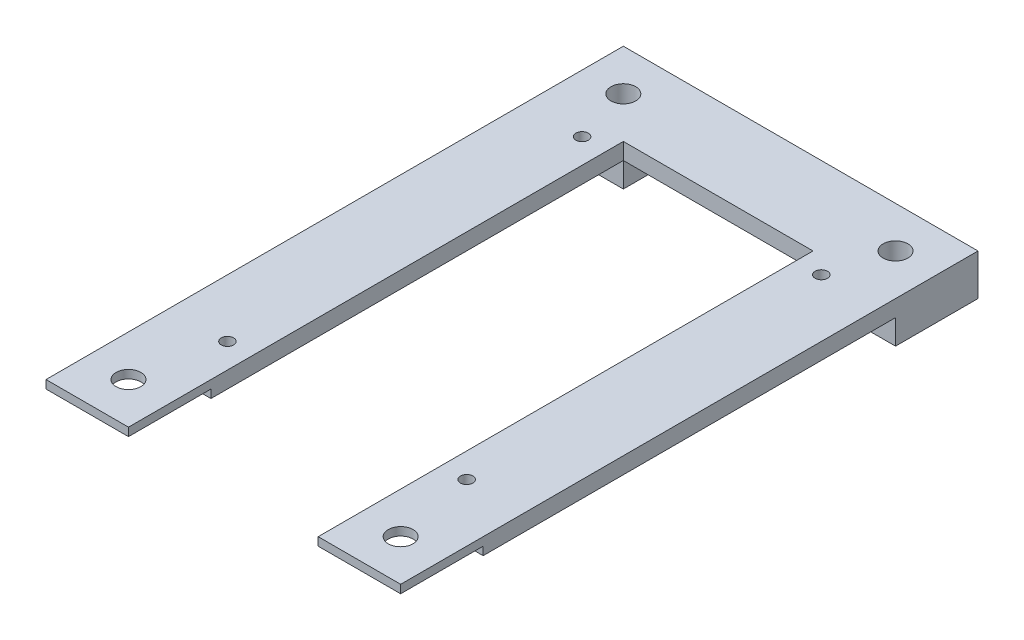
ISO-10303-21;
HEADER;
FILE_DESCRIPTION(('STEP AP214'),'2;1');
FILE_NAME('part.step','',(''),(''),'','','');
FILE_SCHEMA(('AUTOMOTIVE_DESIGN { 1 0 10303 214 1 1 1 1 }'));
ENDSEC;
DATA;
#1=APPLICATION_CONTEXT('core data for automotive mechanical design processes');
#2=APPLICATION_PROTOCOL_DEFINITION('international standard','automotive_design',2000,#1);
#3=PRODUCT_CONTEXT('',#1,'mechanical');
#4=PRODUCT('Part','Part','',(#3));
#5=PRODUCT_RELATED_PRODUCT_CATEGORY('part','',(#4));
#6=PRODUCT_DEFINITION_FORMATION('','',#4);
#7=PRODUCT_DEFINITION_CONTEXT('part definition',#1,'design');
#8=PRODUCT_DEFINITION('design','',#6,#7);
#9=PRODUCT_DEFINITION_SHAPE('','',#8);
#10=(LENGTH_UNIT() NAMED_UNIT(*) SI_UNIT(.MILLI.,.METRE.));
#11=(NAMED_UNIT(*) PLANE_ANGLE_UNIT() SI_UNIT($,.RADIAN.));
#12=(NAMED_UNIT(*) SI_UNIT($,.STERADIAN.) SOLID_ANGLE_UNIT());
#13=UNCERTAINTY_MEASURE_WITH_UNIT(LENGTH_MEASURE(1.E-05),#10,'distance_accuracy_value','');
#14=(GEOMETRIC_REPRESENTATION_CONTEXT(3) GLOBAL_UNCERTAINTY_ASSIGNED_CONTEXT((#13)) GLOBAL_UNIT_ASSIGNED_CONTEXT((#10,
#11,#12)) REPRESENTATION_CONTEXT('',''));
#15=CARTESIAN_POINT('',(0.,0.,0.));
#16=DIRECTION('',(0.,0.,1.));
#17=DIRECTION('',(1.,0.,0.));
#18=AXIS2_PLACEMENT_3D('',#15,#16,#17);
#19=CARTESIAN_POINT('',(66.,4.,-120.));
#20=DIRECTION('',(0.,0.,-1.));
#21=DIRECTION('',(-1.,0.,0.));
#22=AXIS2_PLACEMENT_3D('',#19,#20,#21);
#23=PLANE('',#22);
#24=DIRECTION('',(-1.,0.,0.));
#25=VECTOR('',#24,1.);
#26=CARTESIAN_POINT('',(66.,-6.,-120.));
#27=LINE('',#26,#25);
#28=CARTESIAN_POINT('',(20.,-6.,-120.));
#29=VERTEX_POINT('',#28);
#30=CARTESIAN_POINT('',(0.,-6.,-120.));
#31=VERTEX_POINT('',#30);
#32=EDGE_CURVE('E189',#29,#31,#27,.T.);
#33=ORIENTED_EDGE('',*,*,#32,.F.);
#34=DIRECTION('',(0.,-1.,0.));
#35=VECTOR('',#34,1.);
#36=CARTESIAN_POINT('',(20.,0.,-120.));
#37=LINE('',#36,#35);
#38=CARTESIAN_POINT('',(20.,0.,-120.));
#39=VERTEX_POINT('',#38);
#40=EDGE_CURVE('E166',#39,#29,#37,.T.);
#41=ORIENTED_EDGE('',*,*,#40,.F.);
#42=DIRECTION('',(-1.,0.,0.));
#43=VECTOR('',#42,1.);
#44=CARTESIAN_POINT('',(20.,0.,-120.));
#45=LINE('',#44,#43);
#46=CARTESIAN_POINT('',(0.,0.,-120.));
#47=VERTEX_POINT('',#46);
#48=EDGE_CURVE('E11',#39,#47,#45,.T.);
#49=ORIENTED_EDGE('',*,*,#48,.T.);
#50=DIRECTION('',(0.,1.,0.));
#51=VECTOR('',#50,1.);
#52=CARTESIAN_POINT('',(0.,-6.,-120.));
#53=LINE('',#52,#51);
#54=EDGE_CURVE('E196',#31,#47,#53,.T.);
#55=ORIENTED_EDGE('',*,*,#54,.F.);
#56=EDGE_LOOP('',(#33,#41,#49,#55));
#57=FACE_BOUND('',#56,.T.);
#58=ADVANCED_FACE('F38',(#57),#23,.F.);
#59=DIRECTION('',(0.,-1.,0.));
#60=VECTOR('',#59,1.);
#61=CARTESIAN_POINT('',(20.,4.,-120.));
#62=LINE('',#61,#60);
#63=CARTESIAN_POINT('',(20.,4.,-120.));
#64=VERTEX_POINT('',#63);
#65=EDGE_CURVE('E262',#64,#39,#62,.T.);
#66=ORIENTED_EDGE('',*,*,#65,.T.);
#67=DIRECTION('',(-1.,0.,0.));
#68=VECTOR('',#67,1.);
#69=CARTESIAN_POINT('',(20.,0.,-120.));
#70=LINE('',#69,#68);
#71=CARTESIAN_POINT('',(66.,0.,-120.));
#72=VERTEX_POINT('',#71);
#73=EDGE_CURVE('E180',#72,#39,#70,.T.);
#74=ORIENTED_EDGE('',*,*,#73,.F.);
#75=DIRECTION('',(0.,-1.,0.));
#76=VECTOR('',#75,1.);
#77=CARTESIAN_POINT('',(66.,4.,-120.));
#78=LINE('',#77,#76);
#79=CARTESIAN_POINT('',(66.,4.,-120.));
#80=VERTEX_POINT('',#79);
#81=EDGE_CURVE('E259',#80,#72,#78,.T.);
#82=ORIENTED_EDGE('',*,*,#81,.F.);
#83=DIRECTION('',(1.,0.,0.));
#84=VECTOR('',#83,1.);
#85=CARTESIAN_POINT('',(66.,4.,-120.));
#86=LINE('',#85,#84);
#87=EDGE_CURVE('E224',#64,#80,#86,.T.);
#88=ORIENTED_EDGE('',*,*,#87,.F.);
#89=EDGE_LOOP('',(#66,#74,#82,#88));
#90=FACE_BOUND('',#89,.T.);
#91=ADVANCED_FACE('F309',(#90),#23,.F.);
#92=CARTESIAN_POINT('',(0.,-6.,0.));
#93=DIRECTION('',(0.,-1.,0.));
#94=DIRECTION('',(0.,0.,-1.));
#95=AXIS2_PLACEMENT_3D('',#92,#93,#94);
#96=PLANE('',#95);
#97=DIRECTION('',(0.,0.,1.));
#98=VECTOR('',#97,1.);
#99=CARTESIAN_POINT('',(20.,-6.,-140.));
#100=LINE('',#99,#98);
#101=CARTESIAN_POINT('',(20.,-6.,-140.));
#102=VERTEX_POINT('',#101);
#103=EDGE_CURVE('E160',#102,#29,#100,.T.);
#104=ORIENTED_EDGE('',*,*,#103,.T.);
#105=ORIENTED_EDGE('',*,*,#32,.T.);
#106=DIRECTION('',(0.,0.,-1.));
#107=VECTOR('',#106,1.);
#108=CARTESIAN_POINT('',(0.,-6.,-120.));
#109=LINE('',#108,#107);
#110=CARTESIAN_POINT('',(0.,-6.,-140.));
#111=VERTEX_POINT('',#110);
#112=EDGE_CURVE('E185',#31,#111,#109,.T.);
#113=ORIENTED_EDGE('',*,*,#112,.T.);
#114=DIRECTION('',(1.,0.,0.));
#115=VECTOR('',#114,1.);
#116=CARTESIAN_POINT('',(0.,-6.,-140.));
#117=LINE('',#116,#115);
#118=EDGE_CURVE('E177',#111,#102,#117,.T.);
#119=ORIENTED_EDGE('',*,*,#118,.T.);
#120=EDGE_LOOP('',(#104,#105,#113,#119));
#121=FACE_BOUND('',#120,.T.);
#122=CARTESIAN_POINT('',(10.,-6.,-130.));
#123=DIRECTION('',(0.,-1.,0.));
#124=DIRECTION('',(0.,0.,-1.));
#125=AXIS2_PLACEMENT_3D('',#122,#123,#124);
#126=CIRCLE('',#125,3.);
#127=CARTESIAN_POINT('',(10.,-6.,-133.));
#128=VERTEX_POINT('',#127);
#129=EDGE_CURVE('E199',#128,#128,#126,.T.);
#130=ORIENTED_EDGE('',*,*,#129,.F.);
#131=EDGE_LOOP('',(#130));
#132=FACE_BOUND('',#131,.T.);
#133=ADVANCED_FACE('F182',(#121,#132),#96,.T.);
#134=CARTESIAN_POINT('',(0.,0.,0.));
#135=DIRECTION('',(0.,-1.,0.));
#136=DIRECTION('',(0.,0.,-1.));
#137=AXIS2_PLACEMENT_3D('',#134,#135,#136);
#138=PLANE('',#137);
#139=CARTESIAN_POINT('',(14.,0.,-116.));
#140=DIRECTION('',(0.,-1.,0.));
#141=DIRECTION('',(0.,0.,-1.));
#142=AXIS2_PLACEMENT_3D('',#139,#140,#141);
#143=CIRCLE('',#142,1.5);
#144=CARTESIAN_POINT('',(14.,0.,-117.5));
#145=VERTEX_POINT('',#144);
#146=EDGE_CURVE('E386',#145,#145,#143,.T.);
#147=ORIENTED_EDGE('',*,*,#146,.F.);
#148=EDGE_LOOP('',(#147));
#149=FACE_BOUND('',#148,.T.);
#150=CARTESIAN_POINT('',(14.,0.,-30.));
#151=DIRECTION('',(0.,-1.,0.));
#152=DIRECTION('',(0.,0.,-1.));
#153=AXIS2_PLACEMENT_3D('',#150,#151,#152);
#154=CIRCLE('',#153,1.5);
#155=CARTESIAN_POINT('',(14.,0.,-31.5));
#156=VERTEX_POINT('',#155);
#157=EDGE_CURVE('E383',#156,#156,#154,.T.);
#158=ORIENTED_EDGE('',*,*,#157,.F.);
#159=EDGE_LOOP('',(#158));
#160=FACE_BOUND('',#159,.T.);
#161=DIRECTION('',(0.,0.,-1.));
#162=VECTOR('',#161,1.);
#163=CARTESIAN_POINT('',(20.,0.,-120.));
#164=LINE('',#163,#162);
#165=CARTESIAN_POINT('',(20.,0.,-20.));
#166=VERTEX_POINT('',#165);
#167=EDGE_CURVE('E217',#166,#39,#164,.T.);
#168=ORIENTED_EDGE('',*,*,#167,.F.);
#169=DIRECTION('',(1.,0.,0.));
#170=VECTOR('',#169,1.);
#171=CARTESIAN_POINT('',(20.,0.,-20.));
#172=LINE('',#171,#170);
#173=CARTESIAN_POINT('',(0.,0.,-20.));
#174=VERTEX_POINT('',#173);
#175=EDGE_CURVE('E280',#174,#166,#172,.T.);
#176=ORIENTED_EDGE('',*,*,#175,.F.);
#177=DIRECTION('',(0.,0.,1.));
#178=VECTOR('',#177,1.);
#179=CARTESIAN_POINT('',(0.,0.,0.));
#180=LINE('',#179,#178);
#181=EDGE_CURVE('E222',#47,#174,#180,.T.);
#182=ORIENTED_EDGE('',*,*,#181,.F.);
#183=ORIENTED_EDGE('',*,*,#48,.F.);
#184=EDGE_LOOP('',(#168,#176,#182,#183));
#185=FACE_BOUND('',#184,.T.);
#186=ADVANCED_FACE('F308',(#149,#160,#185),#138,.T.);
#187=CARTESIAN_POINT('',(72.,0.,-30.));
#188=DIRECTION('',(0.,-1.,0.));
#189=DIRECTION('',(0.,0.,-1.));
#190=AXIS2_PLACEMENT_3D('',#187,#188,#189);
#191=CIRCLE('',#190,1.5);
#192=CARTESIAN_POINT('',(72.,0.,-31.5));
#193=VERTEX_POINT('',#192);
#194=EDGE_CURVE('E297',#193,#193,#191,.T.);
#195=ORIENTED_EDGE('',*,*,#194,.F.);
#196=EDGE_LOOP('',(#195));
#197=FACE_BOUND('',#196,.T.);
#198=CARTESIAN_POINT('',(72.,0.,-116.));
#199=DIRECTION('',(0.,-1.,0.));
#200=DIRECTION('',(0.,0.,-1.));
#201=AXIS2_PLACEMENT_3D('',#198,#199,#200);
#202=CIRCLE('',#201,1.50000000000001);
#203=CARTESIAN_POINT('',(72.,0.,-117.5));
#204=VERTEX_POINT('',#203);
#205=EDGE_CURVE('E389',#204,#204,#202,.T.);
#206=ORIENTED_EDGE('',*,*,#205,.F.);
#207=EDGE_LOOP('',(#206));
#208=FACE_BOUND('',#207,.T.);
#209=DIRECTION('',(1.,0.,0.));
#210=VECTOR('',#209,1.);
#211=CARTESIAN_POINT('',(66.,0.,-20.));
#212=LINE('',#211,#210);
#213=CARTESIAN_POINT('',(66.,0.,-20.));
#214=VERTEX_POINT('',#213);
#215=CARTESIAN_POINT('',(86.,0.,-20.));
#216=VERTEX_POINT('',#215);
#217=EDGE_CURVE('E64',#214,#216,#212,.T.);
#218=ORIENTED_EDGE('',*,*,#217,.F.);
#219=DIRECTION('',(0.,0.,1.));
#220=VECTOR('',#219,1.);
#221=CARTESIAN_POINT('',(66.,0.,0.));
#222=LINE('',#221,#220);
#223=EDGE_CURVE('E239',#72,#214,#222,.T.);
#224=ORIENTED_EDGE('',*,*,#223,.F.);
#225=CARTESIAN_POINT('',(86.,0.,-120.));
#226=VERTEX_POINT('',#225);
#227=EDGE_CURVE('E49',#226,#72,#45,.T.);
#228=ORIENTED_EDGE('',*,*,#227,.F.);
#229=DIRECTION('',(0.,0.,-1.));
#230=VECTOR('',#229,1.);
#231=CARTESIAN_POINT('',(86.,0.,-140.));
#232=LINE('',#231,#230);
#233=EDGE_CURVE('E242',#216,#226,#232,.T.);
#234=ORIENTED_EDGE('',*,*,#233,.F.);
#235=EDGE_LOOP('',(#218,#224,#228,#234));
#236=FACE_BOUND('',#235,.T.);
#237=ADVANCED_FACE('F316',(#197,#208,#236),#138,.T.);
#238=CARTESIAN_POINT('',(0.,4.,0.));
#239=DIRECTION('',(0.,-1.,0.));
#240=DIRECTION('',(0.,0.,-1.));
#241=AXIS2_PLACEMENT_3D('',#238,#239,#240);
#242=PLANE('',#241);
#243=CARTESIAN_POINT('',(72.,4.,-30.));
#244=DIRECTION('',(0.,1.,0.));
#245=DIRECTION('',(0.,0.,-1.));
#246=AXIS2_PLACEMENT_3D('',#243,#244,#245);
#247=CIRCLE('',#246,1.5);
#248=CARTESIAN_POINT('',(72.,4.,-31.5));
#249=VERTEX_POINT('',#248);
#250=EDGE_CURVE('E368',#249,#249,#247,.T.);
#251=ORIENTED_EDGE('',*,*,#250,.F.);
#252=EDGE_LOOP('',(#251));
#253=FACE_BOUND('',#252,.T.);
#254=CARTESIAN_POINT('',(72.,4.,-116.));
#255=DIRECTION('',(0.,1.,0.));
#256=DIRECTION('',(0.,0.,-1.));
#257=AXIS2_PLACEMENT_3D('',#254,#255,#256);
#258=CIRCLE('',#257,1.50000000000001);
#259=CARTESIAN_POINT('',(72.,4.,-117.5));
#260=VERTEX_POINT('',#259);
#261=EDGE_CURVE('E376',#260,#260,#258,.T.);
#262=ORIENTED_EDGE('',*,*,#261,.F.);
#263=EDGE_LOOP('',(#262));
#264=FACE_BOUND('',#263,.T.);
#265=CARTESIAN_POINT('',(14.,4.,-116.));
#266=DIRECTION('',(0.,1.,0.));
#267=DIRECTION('',(0.,0.,1.));
#268=AXIS2_PLACEMENT_3D('',#265,#266,#267);
#269=CIRCLE('',#268,1.5);
#270=CARTESIAN_POINT('',(14.,4.,-114.5));
#271=VERTEX_POINT('',#270);
#272=EDGE_CURVE('E372',#271,#271,#269,.T.);
#273=ORIENTED_EDGE('',*,*,#272,.F.);
#274=EDGE_LOOP('',(#273));
#275=FACE_BOUND('',#274,.T.);
#276=CARTESIAN_POINT('',(14.,4.,-30.));
#277=DIRECTION('',(0.,1.,0.));
#278=DIRECTION('',(0.,0.,1.));
#279=AXIS2_PLACEMENT_3D('',#276,#277,#278);
#280=CIRCLE('',#279,1.5);
#281=CARTESIAN_POINT('',(14.,4.,-28.5));
#282=VERTEX_POINT('',#281);
#283=EDGE_CURVE('E375',#282,#282,#280,.T.);
#284=ORIENTED_EDGE('',*,*,#283,.F.);
#285=EDGE_LOOP('',(#284));
#286=FACE_BOUND('',#285,.T.);
#287=CARTESIAN_POINT('',(10.,4.,-10.));
#288=DIRECTION('',(0.,1.,0.));
#289=DIRECTION('',(0.,0.,1.));
#290=AXIS2_PLACEMENT_3D('',#287,#288,#289);
#291=CIRCLE('',#290,3.);
#292=CARTESIAN_POINT('',(10.,4.,-7.));
#293=VERTEX_POINT('',#292);
#294=EDGE_CURVE('E206',#293,#293,#291,.T.);
#295=ORIENTED_EDGE('',*,*,#294,.F.);
#296=EDGE_LOOP('',(#295));
#297=FACE_BOUND('',#296,.T.);
#298=CARTESIAN_POINT('',(76.,4.,-10.));
#299=DIRECTION('',(0.,1.,0.));
#300=DIRECTION('',(0.,0.,1.));
#301=AXIS2_PLACEMENT_3D('',#298,#299,#300);
#302=CIRCLE('',#301,3.00000000000001);
#303=CARTESIAN_POINT('',(76.,4.,-6.99999999999999));
#304=VERTEX_POINT('',#303);
#305=EDGE_CURVE('E205',#304,#304,#302,.T.);
#306=ORIENTED_EDGE('',*,*,#305,.F.);
#307=EDGE_LOOP('',(#306));
#308=FACE_BOUND('',#307,.T.);
#309=DIRECTION('',(1.,0.,0.));
#310=VECTOR('',#309,1.);
#311=CARTESIAN_POINT('',(20.,4.,0.));
#312=LINE('',#311,#310);
#313=CARTESIAN_POINT('',(0.,4.,0.));
#314=VERTEX_POINT('',#313);
#315=CARTESIAN_POINT('',(20.,4.,0.));
#316=VERTEX_POINT('',#315);
#317=EDGE_CURVE('E218',#314,#316,#312,.T.);
#318=ORIENTED_EDGE('',*,*,#317,.T.);
#319=DIRECTION('',(0.,0.,-1.));
#320=VECTOR('',#319,1.);
#321=CARTESIAN_POINT('',(20.,4.,-120.));
#322=LINE('',#321,#320);
#323=EDGE_CURVE('E221',#316,#64,#322,.T.);
#324=ORIENTED_EDGE('',*,*,#323,.T.);
#325=ORIENTED_EDGE('',*,*,#87,.T.);
#326=DIRECTION('',(0.,0.,1.));
#327=VECTOR('',#326,1.);
#328=CARTESIAN_POINT('',(66.,4.,0.));
#329=LINE('',#328,#327);
#330=CARTESIAN_POINT('',(66.,4.,0.));
#331=VERTEX_POINT('',#330);
#332=EDGE_CURVE('E226',#80,#331,#329,.T.);
#333=ORIENTED_EDGE('',*,*,#332,.T.);
#334=DIRECTION('',(1.,0.,0.));
#335=VECTOR('',#334,1.);
#336=CARTESIAN_POINT('',(86.,4.,0.));
#337=LINE('',#336,#335);
#338=CARTESIAN_POINT('',(86.,4.,0.));
#339=VERTEX_POINT('',#338);
#340=EDGE_CURVE('E228',#331,#339,#337,.T.);
#341=ORIENTED_EDGE('',*,*,#340,.T.);
#342=DIRECTION('',(0.,0.,-1.));
#343=VECTOR('',#342,1.);
#344=CARTESIAN_POINT('',(86.,4.,-140.));
#345=LINE('',#344,#343);
#346=CARTESIAN_POINT('',(86.,4.,-140.));
#347=VERTEX_POINT('',#346);
#348=EDGE_CURVE('E230',#339,#347,#345,.T.);
#349=ORIENTED_EDGE('',*,*,#348,.T.);
#350=DIRECTION('',(-1.,0.,0.));
#351=VECTOR('',#350,1.);
#352=CARTESIAN_POINT('',(0.,4.,-140.));
#353=LINE('',#352,#351);
#354=CARTESIAN_POINT('',(0.,4.,-140.));
#355=VERTEX_POINT('',#354);
#356=EDGE_CURVE('E232',#347,#355,#353,.T.);
#357=ORIENTED_EDGE('',*,*,#356,.T.);
#358=DIRECTION('',(0.,0.,1.));
#359=VECTOR('',#358,1.);
#360=CARTESIAN_POINT('',(0.,4.,0.));
#361=LINE('',#360,#359);
#362=EDGE_CURVE('E234',#355,#314,#361,.T.);
#363=ORIENTED_EDGE('',*,*,#362,.T.);
#364=EDGE_LOOP('',(#318,#324,#325,#333,#341,#349,#357,#363));
#365=FACE_BOUND('',#364,.T.);
#366=CARTESIAN_POINT('',(10.,4.,-130.));
#367=DIRECTION('',(0.,1.,0.));
#368=DIRECTION('',(0.,0.,1.));
#369=AXIS2_PLACEMENT_3D('',#366,#367,#368);
#370=CIRCLE('',#369,3.);
#371=CARTESIAN_POINT('',(10.,4.,-127.));
#372=VERTEX_POINT('',#371);
#373=EDGE_CURVE('E214',#372,#372,#370,.T.);
#374=ORIENTED_EDGE('',*,*,#373,.F.);
#375=EDGE_LOOP('',(#374));
#376=FACE_BOUND('',#375,.T.);
#377=CARTESIAN_POINT('',(76.,4.,-130.));
#378=DIRECTION('',(0.,1.,0.));
#379=DIRECTION('',(0.,0.,1.));
#380=AXIS2_PLACEMENT_3D('',#377,#378,#379);
#381=CIRCLE('',#380,3.00000000000001);
#382=CARTESIAN_POINT('',(76.,4.,-127.));
#383=VERTEX_POINT('',#382);
#384=EDGE_CURVE('E209',#383,#383,#381,.T.);
#385=ORIENTED_EDGE('',*,*,#384,.F.);
#386=EDGE_LOOP('',(#385));
#387=FACE_BOUND('',#386,.T.);
#388=ADVANCED_FACE('F416',(#253,#264,#275,#286,#297,#308,#365,#376,#387),#242,.F.);
#389=CARTESIAN_POINT('',(20.,4.,0.));
#390=DIRECTION('',(0.,0.,-1.));
#391=DIRECTION('',(-1.,0.,0.));
#392=AXIS2_PLACEMENT_3D('',#389,#390,#391);
#393=PLANE('',#392);
#394=DIRECTION('',(0.,-1.,0.));
#395=VECTOR('',#394,1.);
#396=CARTESIAN_POINT('',(0.,4.,0.));
#397=LINE('',#396,#395);
#398=CARTESIAN_POINT('',(0.,2.,0.));
#399=VERTEX_POINT('',#398);
#400=EDGE_CURVE('E236',#314,#399,#397,.T.);
#401=ORIENTED_EDGE('',*,*,#400,.T.);
#402=DIRECTION('',(-1.,0.,0.));
#403=VECTOR('',#402,1.);
#404=CARTESIAN_POINT('',(20.,2.,0.));
#405=LINE('',#404,#403);
#406=CARTESIAN_POINT('',(20.,2.,0.));
#407=VERTEX_POINT('',#406);
#408=EDGE_CURVE('E283',#407,#399,#405,.T.);
#409=ORIENTED_EDGE('',*,*,#408,.F.);
#410=DIRECTION('',(0.,-1.,0.));
#411=VECTOR('',#410,1.);
#412=CARTESIAN_POINT('',(20.,4.,0.));
#413=LINE('',#412,#411);
#414=EDGE_CURVE('E47',#316,#407,#413,.T.);
#415=ORIENTED_EDGE('',*,*,#414,.F.);
#416=ORIENTED_EDGE('',*,*,#317,.F.);
#417=EDGE_LOOP('',(#401,#409,#415,#416));
#418=FACE_BOUND('',#417,.T.);
#419=ADVANCED_FACE('F40',(#418),#393,.F.);
#420=CARTESIAN_POINT('',(20.,4.,-120.));
#421=DIRECTION('',(-1.,0.,0.));
#422=DIRECTION('',(0.,0.,1.));
#423=AXIS2_PLACEMENT_3D('',#420,#421,#422);
#424=PLANE('',#423);
#425=ORIENTED_EDGE('',*,*,#414,.T.);
#426=DIRECTION('',(0.,0.,1.));
#427=VECTOR('',#426,1.);
#428=CARTESIAN_POINT('',(20.,2.,-20.));
#429=LINE('',#428,#427);
#430=CARTESIAN_POINT('',(20.,2.,-20.));
#431=VERTEX_POINT('',#430);
#432=EDGE_CURVE('E274',#431,#407,#429,.T.);
#433=ORIENTED_EDGE('',*,*,#432,.F.);
#434=DIRECTION('',(0.,1.,0.));
#435=VECTOR('',#434,1.);
#436=CARTESIAN_POINT('',(20.,0.,-20.));
#437=LINE('',#436,#435);
#438=EDGE_CURVE('E394',#166,#431,#437,.T.);
#439=ORIENTED_EDGE('',*,*,#438,.F.);
#440=ORIENTED_EDGE('',*,*,#167,.T.);
#441=ORIENTED_EDGE('',*,*,#65,.F.);
#442=ORIENTED_EDGE('',*,*,#323,.F.);
#443=EDGE_LOOP('',(#425,#433,#439,#440,#441,#442));
#444=FACE_BOUND('',#443,.T.);
#445=ADVANCED_FACE('F335',(#444),#424,.F.);
#446=ORIENTED_EDGE('',*,*,#227,.T.);
#447=DIRECTION('',(0.,1.,0.));
#448=VECTOR('',#447,1.);
#449=CARTESIAN_POINT('',(66.,0.,-120.));
#450=LINE('',#449,#448);
#451=CARTESIAN_POINT('',(66.,-6.,-120.));
#452=VERTEX_POINT('',#451);
#453=EDGE_CURVE('E348',#452,#72,#450,.T.);
#454=ORIENTED_EDGE('',*,*,#453,.F.);
#455=CARTESIAN_POINT('',(86.,-6.,-120.));
#456=VERTEX_POINT('',#455);
#457=EDGE_CURVE('E194',#456,#452,#27,.T.);
#458=ORIENTED_EDGE('',*,*,#457,.F.);
#459=DIRECTION('',(0.,1.,0.));
#460=VECTOR('',#459,1.);
#461=CARTESIAN_POINT('',(86.,-6.,-120.));
#462=LINE('',#461,#460);
#463=EDGE_CURVE('E202',#456,#226,#462,.T.);
#464=ORIENTED_EDGE('',*,*,#463,.T.);
#465=EDGE_LOOP('',(#446,#454,#458,#464));
#466=FACE_BOUND('',#465,.T.);
#467=ADVANCED_FACE('F321',(#466),#23,.F.);
#468=CARTESIAN_POINT('',(66.,4.,0.));
#469=DIRECTION('',(1.,0.,0.));
#470=DIRECTION('',(0.,0.,-1.));
#471=AXIS2_PLACEMENT_3D('',#468,#469,#470);
#472=PLANE('',#471);
#473=DIRECTION('',(0.,-1.,0.));
#474=VECTOR('',#473,1.);
#475=CARTESIAN_POINT('',(66.,0.,-20.));
#476=LINE('',#475,#474);
#477=CARTESIAN_POINT('',(66.,2.,-20.));
#478=VERTEX_POINT('',#477);
#479=EDGE_CURVE('E286',#478,#214,#476,.T.);
#480=ORIENTED_EDGE('',*,*,#479,.F.);
#481=DIRECTION('',(0.,0.,1.));
#482=VECTOR('',#481,1.);
#483=CARTESIAN_POINT('',(66.,2.,-20.));
#484=LINE('',#483,#482);
#485=CARTESIAN_POINT('',(66.,2.,0.));
#486=VERTEX_POINT('',#485);
#487=EDGE_CURVE('E298',#478,#486,#484,.T.);
#488=ORIENTED_EDGE('',*,*,#487,.T.);
#489=DIRECTION('',(0.,-1.,0.));
#490=VECTOR('',#489,1.);
#491=CARTESIAN_POINT('',(66.,4.,0.));
#492=LINE('',#491,#490);
#493=EDGE_CURVE('E256',#331,#486,#492,.T.);
#494=ORIENTED_EDGE('',*,*,#493,.F.);
#495=ORIENTED_EDGE('',*,*,#332,.F.);
#496=ORIENTED_EDGE('',*,*,#81,.T.);
#497=ORIENTED_EDGE('',*,*,#223,.T.);
#498=EDGE_LOOP('',(#480,#488,#494,#495,#496,#497));
#499=FACE_BOUND('',#498,.T.);
#500=ADVANCED_FACE('F334',(#499),#472,.F.);
#501=CARTESIAN_POINT('',(86.,4.,0.));
#502=DIRECTION('',(0.,0.,-1.));
#503=DIRECTION('',(-1.,0.,0.));
#504=AXIS2_PLACEMENT_3D('',#501,#502,#503);
#505=PLANE('',#504);
#506=ORIENTED_EDGE('',*,*,#493,.T.);
#507=DIRECTION('',(-1.,0.,0.));
#508=VECTOR('',#507,1.);
#509=CARTESIAN_POINT('',(66.,2.,0.));
#510=LINE('',#509,#508);
#511=CARTESIAN_POINT('',(86.,2.,0.));
#512=VERTEX_POINT('',#511);
#513=EDGE_CURVE('E288',#512,#486,#510,.T.);
#514=ORIENTED_EDGE('',*,*,#513,.F.);
#515=DIRECTION('',(0.,-1.,0.));
#516=VECTOR('',#515,1.);
#517=CARTESIAN_POINT('',(86.,4.,0.));
#518=LINE('',#517,#516);
#519=EDGE_CURVE('E253',#339,#512,#518,.T.);
#520=ORIENTED_EDGE('',*,*,#519,.F.);
#521=ORIENTED_EDGE('',*,*,#340,.F.);
#522=EDGE_LOOP('',(#506,#514,#520,#521));
#523=FACE_BOUND('',#522,.T.);
#524=ADVANCED_FACE('F341',(#523),#505,.F.);
#525=CARTESIAN_POINT('',(86.,4.,-140.));
#526=DIRECTION('',(-1.,0.,0.));
#527=DIRECTION('',(0.,0.,1.));
#528=AXIS2_PLACEMENT_3D('',#525,#526,#527);
#529=PLANE('',#528);
#530=ORIENTED_EDGE('',*,*,#519,.T.);
#531=DIRECTION('',(0.,0.,1.));
#532=VECTOR('',#531,1.);
#533=CARTESIAN_POINT('',(86.,2.,-20.));
#534=LINE('',#533,#532);
#535=CARTESIAN_POINT('',(86.,2.,-20.));
#536=VERTEX_POINT('',#535);
#537=EDGE_CURVE('E295',#536,#512,#534,.T.);
#538=ORIENTED_EDGE('',*,*,#537,.F.);
#539=DIRECTION('',(0.,1.,0.));
#540=VECTOR('',#539,1.);
#541=CARTESIAN_POINT('',(86.,0.,-20.));
#542=LINE('',#541,#540);
#543=EDGE_CURVE('E290',#216,#536,#542,.T.);
#544=ORIENTED_EDGE('',*,*,#543,.F.);
#545=ORIENTED_EDGE('',*,*,#233,.T.);
#546=ORIENTED_EDGE('',*,*,#463,.F.);
#547=DIRECTION('',(0.,0.,1.));
#548=VECTOR('',#547,1.);
#549=CARTESIAN_POINT('',(86.,-6.,-120.));
#550=LINE('',#549,#548);
#551=CARTESIAN_POINT('',(86.,-6.,-140.));
#552=VERTEX_POINT('',#551);
#553=EDGE_CURVE('E186',#552,#456,#550,.T.);
#554=ORIENTED_EDGE('',*,*,#553,.F.);
#555=DIRECTION('',(0.,-1.,0.));
#556=VECTOR('',#555,1.);
#557=CARTESIAN_POINT('',(86.,4.,-140.));
#558=LINE('',#557,#556);
#559=EDGE_CURVE('E250',#347,#552,#558,.T.);
#560=ORIENTED_EDGE('',*,*,#559,.F.);
#561=ORIENTED_EDGE('',*,*,#348,.F.);
#562=EDGE_LOOP('',(#530,#538,#544,#545,#546,#554,#560,#561));
#563=FACE_BOUND('',#562,.T.);
#564=ADVANCED_FACE('F422',(#563),#529,.F.);
#565=CARTESIAN_POINT('',(0.,4.,-140.));
#566=DIRECTION('',(0.,0.,1.));
#567=DIRECTION('',(1.,0.,0.));
#568=AXIS2_PLACEMENT_3D('',#565,#566,#567);
#569=PLANE('',#568);
#570=DIRECTION('',(-1.,0.,0.));
#571=VECTOR('',#570,1.);
#572=CARTESIAN_POINT('',(20.,0.,-140.));
#573=LINE('',#572,#571);
#574=CARTESIAN_POINT('',(66.,0.,-140.));
#575=VERTEX_POINT('',#574);
#576=CARTESIAN_POINT('',(20.,0.,-140.));
#577=VERTEX_POINT('',#576);
#578=EDGE_CURVE('E171',#575,#577,#573,.T.);
#579=ORIENTED_EDGE('',*,*,#578,.T.);
#580=DIRECTION('',(0.,-1.,0.));
#581=VECTOR('',#580,1.);
#582=CARTESIAN_POINT('',(20.,0.,-140.));
#583=LINE('',#582,#581);
#584=EDGE_CURVE('E163',#577,#102,#583,.T.);
#585=ORIENTED_EDGE('',*,*,#584,.T.);
#586=ORIENTED_EDGE('',*,*,#118,.F.);
#587=DIRECTION('',(0.,-1.,0.));
#588=VECTOR('',#587,1.);
#589=CARTESIAN_POINT('',(0.,4.,-140.));
#590=LINE('',#589,#588);
#591=EDGE_CURVE('E248',#355,#111,#590,.T.);
#592=ORIENTED_EDGE('',*,*,#591,.F.);
#593=ORIENTED_EDGE('',*,*,#356,.F.);
#594=ORIENTED_EDGE('',*,*,#559,.T.);
#595=CARTESIAN_POINT('',(66.,-6.,-140.));
#596=VERTEX_POINT('',#595);
#597=EDGE_CURVE('E187',#596,#552,#117,.T.);
#598=ORIENTED_EDGE('',*,*,#597,.F.);
#599=DIRECTION('',(0.,1.,0.));
#600=VECTOR('',#599,1.);
#601=CARTESIAN_POINT('',(66.,0.,-140.));
#602=LINE('',#601,#600);
#603=EDGE_CURVE('E56',#596,#575,#602,.T.);
#604=ORIENTED_EDGE('',*,*,#603,.T.);
#605=EDGE_LOOP('',(#579,#585,#586,#592,#593,#594,#598,#604));
#606=FACE_BOUND('',#605,.T.);
#607=ADVANCED_FACE('F175',(#606),#569,.F.);
#608=CARTESIAN_POINT('',(0.,4.,0.));
#609=DIRECTION('',(1.,0.,0.));
#610=DIRECTION('',(0.,0.,-1.));
#611=AXIS2_PLACEMENT_3D('',#608,#609,#610);
#612=PLANE('',#611);
#613=DIRECTION('',(0.,-1.,0.));
#614=VECTOR('',#613,1.);
#615=CARTESIAN_POINT('',(0.,0.,-20.));
#616=LINE('',#615,#614);
#617=CARTESIAN_POINT('',(0.,2.,-20.));
#618=VERTEX_POINT('',#617);
#619=EDGE_CURVE('E399',#618,#174,#616,.T.);
#620=ORIENTED_EDGE('',*,*,#619,.F.);
#621=DIRECTION('',(0.,0.,1.));
#622=VECTOR('',#621,1.);
#623=CARTESIAN_POINT('',(0.,2.,-20.));
#624=LINE('',#623,#622);
#625=EDGE_CURVE('E268',#618,#399,#624,.T.);
#626=ORIENTED_EDGE('',*,*,#625,.T.);
#627=ORIENTED_EDGE('',*,*,#400,.F.);
#628=ORIENTED_EDGE('',*,*,#362,.F.);
#629=ORIENTED_EDGE('',*,*,#591,.T.);
#630=ORIENTED_EDGE('',*,*,#112,.F.);
#631=ORIENTED_EDGE('',*,*,#54,.T.);
#632=ORIENTED_EDGE('',*,*,#181,.T.);
#633=EDGE_LOOP('',(#620,#626,#627,#628,#629,#630,#631,#632));
#634=FACE_BOUND('',#633,.T.);
#635=ADVANCED_FACE('F409',(#634),#612,.F.);
#636=CARTESIAN_POINT('',(10.,4.,-130.));
#637=DIRECTION('',(0.,-1.,0.));
#638=DIRECTION('',(0.,0.,-1.));
#639=AXIS2_PLACEMENT_3D('',#636,#637,#638);
#640=CYLINDRICAL_SURFACE('',#639,3.);
#641=ORIENTED_EDGE('',*,*,#373,.T.);
#642=EDGE_LOOP('',(#641));
#643=FACE_BOUND('',#642,.T.);
#644=ORIENTED_EDGE('',*,*,#129,.T.);
#645=EDGE_LOOP('',(#644));
#646=FACE_BOUND('',#645,.T.);
#647=ADVANCED_FACE('F306',(#643,#646),#640,.F.);
#648=CARTESIAN_POINT('',(76.,4.,-130.));
#649=DIRECTION('',(0.,-1.,0.));
#650=DIRECTION('',(0.,0.,-1.));
#651=AXIS2_PLACEMENT_3D('',#648,#649,#650);
#652=CYLINDRICAL_SURFACE('',#651,3.00000000000001);
#653=ORIENTED_EDGE('',*,*,#384,.T.);
#654=EDGE_LOOP('',(#653));
#655=FACE_BOUND('',#654,.T.);
#656=CARTESIAN_POINT('',(76.,-6.,-130.));
#657=DIRECTION('',(0.,-1.,0.));
#658=DIRECTION('',(0.,0.,-1.));
#659=AXIS2_PLACEMENT_3D('',#656,#657,#658);
#660=CIRCLE('',#659,3.00000000000001);
#661=CARTESIAN_POINT('',(76.,-6.,-133.));
#662=VERTEX_POINT('',#661);
#663=EDGE_CURVE('E272',#662,#662,#660,.T.);
#664=ORIENTED_EDGE('',*,*,#663,.T.);
#665=EDGE_LOOP('',(#664));
#666=FACE_BOUND('',#665,.T.);
#667=ADVANCED_FACE('F472',(#655,#666),#652,.F.);
#668=CARTESIAN_POINT('',(76.,0.,-10.));
#669=DIRECTION('',(0.,1.,0.));
#670=DIRECTION('',(0.,0.,1.));
#671=AXIS2_PLACEMENT_3D('',#668,#669,#670);
#672=CYLINDRICAL_SURFACE('',#671,3.00000000000001);
#673=CARTESIAN_POINT('',(76.,2.,-10.));
#674=DIRECTION('',(0.,1.,0.));
#675=DIRECTION('',(0.,0.,1.));
#676=AXIS2_PLACEMENT_3D('',#673,#674,#675);
#677=CIRCLE('',#676,3.00000000000001);
#678=CARTESIAN_POINT('',(76.,2.,-6.99999999999999));
#679=VERTEX_POINT('',#678);
#680=EDGE_CURVE('E42',#679,#679,#677,.F.);
#681=ORIENTED_EDGE('',*,*,#680,.T.);
#682=EDGE_LOOP('',(#681));
#683=FACE_BOUND('',#682,.T.);
#684=ORIENTED_EDGE('',*,*,#305,.T.);
#685=EDGE_LOOP('',(#684));
#686=FACE_BOUND('',#685,.T.);
#687=ADVANCED_FACE('F469',(#683,#686),#672,.F.);
#688=CARTESIAN_POINT('',(10.,0.,-10.));
#689=DIRECTION('',(0.,1.,0.));
#690=DIRECTION('',(0.,0.,1.));
#691=AXIS2_PLACEMENT_3D('',#688,#689,#690);
#692=CYLINDRICAL_SURFACE('',#691,3.);
#693=CARTESIAN_POINT('',(10.,2.,-10.));
#694=DIRECTION('',(0.,1.,0.));
#695=DIRECTION('',(0.,0.,1.));
#696=AXIS2_PLACEMENT_3D('',#693,#694,#695);
#697=CIRCLE('',#696,3.);
#698=CARTESIAN_POINT('',(10.,2.,-7.));
#699=VERTEX_POINT('',#698);
#700=EDGE_CURVE('E266',#699,#699,#697,.F.);
#701=ORIENTED_EDGE('',*,*,#700,.T.);
#702=EDGE_LOOP('',(#701));
#703=FACE_BOUND('',#702,.T.);
#704=ORIENTED_EDGE('',*,*,#294,.T.);
#705=EDGE_LOOP('',(#704));
#706=FACE_BOUND('',#705,.T.);
#707=ADVANCED_FACE('F326',(#703,#706),#692,.F.);
#708=DIRECTION('',(0.,0.,1.));
#709=VECTOR('',#708,1.);
#710=CARTESIAN_POINT('',(66.,-6.,-140.));
#711=LINE('',#710,#709);
#712=EDGE_CURVE('E170',#596,#452,#711,.T.);
#713=ORIENTED_EDGE('',*,*,#712,.F.);
#714=ORIENTED_EDGE('',*,*,#597,.T.);
#715=ORIENTED_EDGE('',*,*,#553,.T.);
#716=ORIENTED_EDGE('',*,*,#457,.T.);
#717=EDGE_LOOP('',(#713,#714,#715,#716));
#718=FACE_BOUND('',#717,.T.);
#719=ORIENTED_EDGE('',*,*,#663,.F.);
#720=EDGE_LOOP('',(#719));
#721=FACE_BOUND('',#720,.T.);
#722=ADVANCED_FACE('F311',(#718,#721),#96,.T.);
#723=CARTESIAN_POINT('',(20.,2.,-20.));
#724=DIRECTION('',(0.,1.,0.));
#725=DIRECTION('',(0.,0.,1.));
#726=AXIS2_PLACEMENT_3D('',#723,#724,#725);
#727=PLANE('',#726);
#728=ORIENTED_EDGE('',*,*,#408,.T.);
#729=ORIENTED_EDGE('',*,*,#625,.F.);
#730=DIRECTION('',(-1.,0.,0.));
#731=VECTOR('',#730,1.);
#732=CARTESIAN_POINT('',(20.,2.,-20.));
#733=LINE('',#732,#731);
#734=EDGE_CURVE('E397',#431,#618,#733,.T.);
#735=ORIENTED_EDGE('',*,*,#734,.F.);
#736=ORIENTED_EDGE('',*,*,#432,.T.);
#737=EDGE_LOOP('',(#728,#729,#735,#736));
#738=FACE_BOUND('',#737,.T.);
#739=ORIENTED_EDGE('',*,*,#700,.F.);
#740=EDGE_LOOP('',(#739));
#741=FACE_BOUND('',#740,.T.);
#742=ADVANCED_FACE('F325',(#738,#741),#727,.F.);
#743=CARTESIAN_POINT('',(0.,0.,-20.));
#744=DIRECTION('',(0.,0.,1.));
#745=DIRECTION('',(1.,0.,0.));
#746=AXIS2_PLACEMENT_3D('',#743,#744,#745);
#747=PLANE('',#746);
#748=ORIENTED_EDGE('',*,*,#438,.T.);
#749=ORIENTED_EDGE('',*,*,#734,.T.);
#750=ORIENTED_EDGE('',*,*,#619,.T.);
#751=ORIENTED_EDGE('',*,*,#175,.T.);
#752=EDGE_LOOP('',(#748,#749,#750,#751));
#753=FACE_BOUND('',#752,.T.);
#754=ADVANCED_FACE('F403',(#753),#747,.T.);
#755=CARTESIAN_POINT('',(66.,2.,-20.));
#756=DIRECTION('',(0.,1.,0.));
#757=DIRECTION('',(0.,0.,1.));
#758=AXIS2_PLACEMENT_3D('',#755,#756,#757);
#759=PLANE('',#758);
#760=ORIENTED_EDGE('',*,*,#513,.T.);
#761=ORIENTED_EDGE('',*,*,#487,.F.);
#762=DIRECTION('',(-1.,0.,0.));
#763=VECTOR('',#762,1.);
#764=CARTESIAN_POINT('',(66.,2.,-20.));
#765=LINE('',#764,#763);
#766=EDGE_CURVE('E292',#536,#478,#765,.T.);
#767=ORIENTED_EDGE('',*,*,#766,.F.);
#768=ORIENTED_EDGE('',*,*,#537,.T.);
#769=EDGE_LOOP('',(#760,#761,#767,#768));
#770=FACE_BOUND('',#769,.T.);
#771=ORIENTED_EDGE('',*,*,#680,.F.);
#772=EDGE_LOOP('',(#771));
#773=FACE_BOUND('',#772,.T.);
#774=ADVANCED_FACE('F456',(#770,#773),#759,.F.);
#775=CARTESIAN_POINT('',(0.,0.,-20.));
#776=DIRECTION('',(0.,0.,-1.));
#777=DIRECTION('',(-1.,0.,0.));
#778=AXIS2_PLACEMENT_3D('',#775,#776,#777);
#779=PLANE('',#778);
#780=ORIENTED_EDGE('',*,*,#479,.T.);
#781=ORIENTED_EDGE('',*,*,#217,.T.);
#782=ORIENTED_EDGE('',*,*,#543,.T.);
#783=ORIENTED_EDGE('',*,*,#766,.T.);
#784=EDGE_LOOP('',(#780,#781,#782,#783));
#785=FACE_BOUND('',#784,.T.);
#786=ADVANCED_FACE('F452',(#785),#779,.F.);
#787=CARTESIAN_POINT('',(14.,-16.,-30.));
#788=DIRECTION('',(0.,1.,0.));
#789=DIRECTION('',(0.,0.,1.));
#790=AXIS2_PLACEMENT_3D('',#787,#788,#789);
#791=CYLINDRICAL_SURFACE('',#790,1.5);
#792=ORIENTED_EDGE('',*,*,#157,.T.);
#793=EDGE_LOOP('',(#792));
#794=FACE_BOUND('',#793,.T.);
#795=ORIENTED_EDGE('',*,*,#283,.T.);
#796=EDGE_LOOP('',(#795));
#797=FACE_BOUND('',#796,.T.);
#798=ADVANCED_FACE('F442',(#794,#797),#791,.F.);
#799=CARTESIAN_POINT('',(14.,-16.,-116.));
#800=DIRECTION('',(0.,1.,0.));
#801=DIRECTION('',(0.,0.,1.));
#802=AXIS2_PLACEMENT_3D('',#799,#800,#801);
#803=CYLINDRICAL_SURFACE('',#802,1.5);
#804=ORIENTED_EDGE('',*,*,#146,.T.);
#805=EDGE_LOOP('',(#804));
#806=FACE_BOUND('',#805,.T.);
#807=ORIENTED_EDGE('',*,*,#272,.T.);
#808=EDGE_LOOP('',(#807));
#809=FACE_BOUND('',#808,.T.);
#810=ADVANCED_FACE('F438',(#806,#809),#803,.F.);
#811=CARTESIAN_POINT('',(72.,-16.,-116.));
#812=DIRECTION('',(0.,1.,0.));
#813=DIRECTION('',(0.,0.,1.));
#814=AXIS2_PLACEMENT_3D('',#811,#812,#813);
#815=CYLINDRICAL_SURFACE('',#814,1.50000000000001);
#816=ORIENTED_EDGE('',*,*,#205,.T.);
#817=EDGE_LOOP('',(#816));
#818=FACE_BOUND('',#817,.T.);
#819=ORIENTED_EDGE('',*,*,#261,.T.);
#820=EDGE_LOOP('',(#819));
#821=FACE_BOUND('',#820,.T.);
#822=ADVANCED_FACE('F441',(#818,#821),#815,.F.);
#823=CARTESIAN_POINT('',(72.,-16.,-30.));
#824=DIRECTION('',(0.,1.,0.));
#825=DIRECTION('',(0.,0.,1.));
#826=AXIS2_PLACEMENT_3D('',#823,#824,#825);
#827=CYLINDRICAL_SURFACE('',#826,1.5);
#828=ORIENTED_EDGE('',*,*,#194,.T.);
#829=EDGE_LOOP('',(#828));
#830=FACE_BOUND('',#829,.T.);
#831=ORIENTED_EDGE('',*,*,#250,.T.);
#832=EDGE_LOOP('',(#831));
#833=FACE_BOUND('',#832,.T.);
#834=ADVANCED_FACE('F435',(#830,#833),#827,.F.);
#835=CARTESIAN_POINT('',(20.,0.,-140.));
#836=DIRECTION('',(-1.,0.,0.));
#837=DIRECTION('',(0.,0.,1.));
#838=AXIS2_PLACEMENT_3D('',#835,#836,#837);
#839=PLANE('',#838);
#840=ORIENTED_EDGE('',*,*,#40,.T.);
#841=ORIENTED_EDGE('',*,*,#103,.F.);
#842=ORIENTED_EDGE('',*,*,#584,.F.);
#843=DIRECTION('',(0.,0.,1.));
#844=VECTOR('',#843,1.);
#845=CARTESIAN_POINT('',(20.,0.,-140.));
#846=LINE('',#845,#844);
#847=EDGE_CURVE('E366',#577,#39,#846,.T.);
#848=ORIENTED_EDGE('',*,*,#847,.T.);
#849=EDGE_LOOP('',(#840,#841,#842,#848));
#850=FACE_BOUND('',#849,.T.);
#851=ADVANCED_FACE('F162',(#850),#839,.F.);
#852=CARTESIAN_POINT('',(20.,0.,-140.));
#853=DIRECTION('',(0.,1.,0.));
#854=DIRECTION('',(0.,0.,1.));
#855=AXIS2_PLACEMENT_3D('',#852,#853,#854);
#856=PLANE('',#855);
#857=ORIENTED_EDGE('',*,*,#73,.T.);
#858=ORIENTED_EDGE('',*,*,#847,.F.);
#859=ORIENTED_EDGE('',*,*,#578,.F.);
#860=DIRECTION('',(0.,0.,1.));
#861=VECTOR('',#860,1.);
#862=CARTESIAN_POINT('',(66.,0.,-140.));
#863=LINE('',#862,#861);
#864=EDGE_CURVE('E369',#575,#72,#863,.T.);
#865=ORIENTED_EDGE('',*,*,#864,.T.);
#866=EDGE_LOOP('',(#857,#858,#859,#865));
#867=FACE_BOUND('',#866,.T.);
#868=ADVANCED_FACE('F427',(#867),#856,.F.);
#869=CARTESIAN_POINT('',(66.,0.,-140.));
#870=DIRECTION('',(1.,0.,0.));
#871=DIRECTION('',(0.,0.,-1.));
#872=AXIS2_PLACEMENT_3D('',#869,#870,#871);
#873=PLANE('',#872);
#874=ORIENTED_EDGE('',*,*,#453,.T.);
#875=ORIENTED_EDGE('',*,*,#864,.F.);
#876=ORIENTED_EDGE('',*,*,#603,.F.);
#877=ORIENTED_EDGE('',*,*,#712,.T.);
#878=EDGE_LOOP('',(#874,#875,#876,#877));
#879=FACE_BOUND('',#878,.T.);
#880=ADVANCED_FACE('F426',(#879),#873,.F.);
#881=CLOSED_SHELL('',(#58,#91,#133,#186,#237,#388,#419,#445,#467,#500,#524,#564,#607,#635,#647,
#667,#687,#707,#722,#742,#754,#774,#786,#798,#810,#822,#834,#851,#868,#880));
#882=MANIFOLD_SOLID_BREP('B2',#881);
#883=ADVANCED_BREP_SHAPE_REPRESENTATION('',(#18,#882),#14);
#884=SHAPE_DEFINITION_REPRESENTATION(#9,#883);
ENDSEC;
END-ISO-10303-21;
